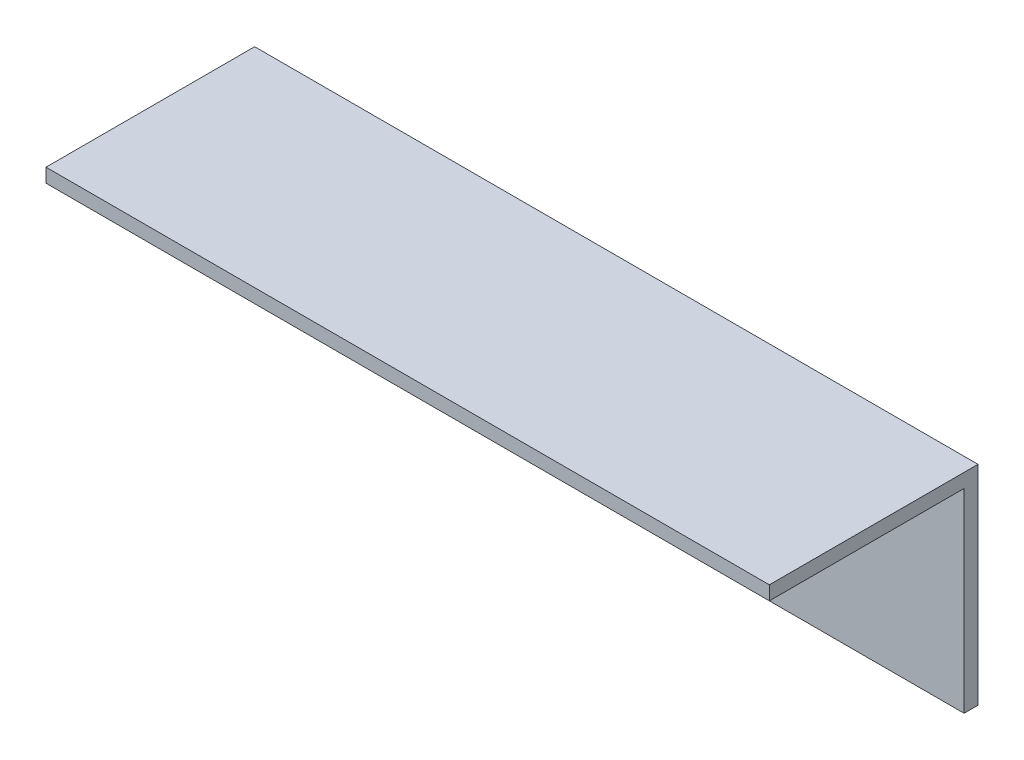
ISO-10303-21;
HEADER;
FILE_DESCRIPTION(('STEP AP214'),'2;1');
FILE_NAME('part.step','',(''),(''),'','','');
FILE_SCHEMA(('AUTOMOTIVE_DESIGN { 1 0 10303 214 1 1 1 1 }'));
ENDSEC;
DATA;
#1=APPLICATION_CONTEXT('core data for automotive mechanical design processes');
#2=APPLICATION_PROTOCOL_DEFINITION('international standard','automotive_design',2000,#1);
#3=PRODUCT_CONTEXT('',#1,'mechanical');
#4=PRODUCT('Part','Part','',(#3));
#5=PRODUCT_RELATED_PRODUCT_CATEGORY('part','',(#4));
#6=PRODUCT_DEFINITION_FORMATION('','',#4);
#7=PRODUCT_DEFINITION_CONTEXT('part definition',#1,'design');
#8=PRODUCT_DEFINITION('design','',#6,#7);
#9=PRODUCT_DEFINITION_SHAPE('','',#8);
#10=(LENGTH_UNIT() NAMED_UNIT(*) SI_UNIT(.MILLI.,.METRE.));
#11=(NAMED_UNIT(*) PLANE_ANGLE_UNIT() SI_UNIT($,.RADIAN.));
#12=(NAMED_UNIT(*) SI_UNIT($,.STERADIAN.) SOLID_ANGLE_UNIT());
#13=UNCERTAINTY_MEASURE_WITH_UNIT(LENGTH_MEASURE(1.E-05),#10,'distance_accuracy_value','');
#14=(GEOMETRIC_REPRESENTATION_CONTEXT(3) GLOBAL_UNCERTAINTY_ASSIGNED_CONTEXT((#13)) GLOBAL_UNIT_ASSIGNED_CONTEXT((#10,
#11,#12)) REPRESENTATION_CONTEXT('',''));
#15=CARTESIAN_POINT('',(0.,0.,0.));
#16=DIRECTION('',(0.,0.,1.));
#17=DIRECTION('',(1.,0.,0.));
#18=AXIS2_PLACEMENT_3D('',#15,#16,#17);
#19=CARTESIAN_POINT('',(0.,0.,30.));
#20=DIRECTION('',(0.,1.,0.));
#21=DIRECTION('',(0.,0.,1.));
#22=AXIS2_PLACEMENT_3D('',#19,#20,#21);
#23=PLANE('',#22);
#24=DIRECTION('',(1.,0.,0.));
#25=VECTOR('',#24,1.);
#26=CARTESIAN_POINT('',(-104.,0.,2.));
#27=LINE('',#26,#25);
#28=CARTESIAN_POINT('',(-104.,0.,2.));
#29=VERTEX_POINT('',#28);
#30=CARTESIAN_POINT('',(0.,0.,2.));
#31=VERTEX_POINT('',#30);
#32=EDGE_CURVE('E129',#29,#31,#27,.T.);
#33=ORIENTED_EDGE('',*,*,#32,.F.);
#34=DIRECTION('',(0.,0.,-1.));
#35=VECTOR('',#34,1.);
#36=CARTESIAN_POINT('',(-104.,0.,30.));
#37=LINE('',#36,#35);
#38=CARTESIAN_POINT('',(-104.,0.,0.));
#39=VERTEX_POINT('',#38);
#40=EDGE_CURVE('E88',#29,#39,#37,.T.);
#41=ORIENTED_EDGE('',*,*,#40,.T.);
#42=DIRECTION('',(1.,0.,0.));
#43=VECTOR('',#42,1.);
#44=CARTESIAN_POINT('',(0.,0.,0.));
#45=LINE('',#44,#43);
#46=CARTESIAN_POINT('',(0.,0.,0.));
#47=VERTEX_POINT('',#46);
#48=EDGE_CURVE('E92',#39,#47,#45,.T.);
#49=ORIENTED_EDGE('',*,*,#48,.T.);
#50=DIRECTION('',(0.,0.,-1.));
#51=VECTOR('',#50,1.);
#52=CARTESIAN_POINT('',(0.,0.,30.));
#53=LINE('',#52,#51);
#54=EDGE_CURVE('E77',#31,#47,#53,.T.);
#55=ORIENTED_EDGE('',*,*,#54,.F.);
#56=EDGE_LOOP('',(#33,#41,#49,#55));
#57=FACE_BOUND('',#56,.T.);
#58=ADVANCED_FACE('F33',(#57),#23,.F.);
#59=CARTESIAN_POINT('',(0.,0.,30.));
#60=DIRECTION('',(-1.,0.,0.));
#61=DIRECTION('',(0.,-1.,0.));
#62=AXIS2_PLACEMENT_3D('',#59,#60,#61);
#63=PLANE('',#62);
#64=DIRECTION('',(0.,1.,0.));
#65=VECTOR('',#64,1.);
#66=CARTESIAN_POINT('',(0.,0.,30.));
#67=LINE('',#66,#65);
#68=CARTESIAN_POINT('',(0.,28.,30.));
#69=VERTEX_POINT('',#68);
#70=CARTESIAN_POINT('',(0.,30.,30.));
#71=VERTEX_POINT('',#70);
#72=EDGE_CURVE('E97',#69,#71,#67,.T.);
#73=ORIENTED_EDGE('',*,*,#72,.F.);
#74=DIRECTION('',(0.,0.,1.));
#75=VECTOR('',#74,1.);
#76=CARTESIAN_POINT('',(0.,28.,2.));
#77=LINE('',#76,#75);
#78=CARTESIAN_POINT('',(0.,28.,2.));
#79=VERTEX_POINT('',#78);
#80=EDGE_CURVE('E48',#79,#69,#77,.T.);
#81=ORIENTED_EDGE('',*,*,#80,.F.);
#82=DIRECTION('',(0.,1.,0.));
#83=VECTOR('',#82,1.);
#84=CARTESIAN_POINT('',(0.,28.,2.));
#85=LINE('',#84,#83);
#86=EDGE_CURVE('E85',#31,#79,#85,.T.);
#87=ORIENTED_EDGE('',*,*,#86,.F.);
#88=ORIENTED_EDGE('',*,*,#54,.T.);
#89=DIRECTION('',(0.,1.,0.));
#90=VECTOR('',#89,1.);
#91=CARTESIAN_POINT('',(0.,0.,0.));
#92=LINE('',#91,#90);
#93=CARTESIAN_POINT('',(0.,30.,0.));
#94=VERTEX_POINT('',#93);
#95=EDGE_CURVE('E82',#47,#94,#92,.T.);
#96=ORIENTED_EDGE('',*,*,#95,.T.);
#97=DIRECTION('',(0.,0.,-1.));
#98=VECTOR('',#97,1.);
#99=CARTESIAN_POINT('',(0.,30.,30.));
#100=LINE('',#99,#98);
#101=EDGE_CURVE('E11',#71,#94,#100,.T.);
#102=ORIENTED_EDGE('',*,*,#101,.F.);
#103=EDGE_LOOP('',(#73,#81,#87,#88,#96,#102));
#104=FACE_BOUND('',#103,.T.);
#105=ADVANCED_FACE('F35',(#104),#63,.F.);
#106=CARTESIAN_POINT('',(0.,30.,30.));
#107=DIRECTION('',(0.,-1.,0.));
#108=DIRECTION('',(1.,0.,0.));
#109=AXIS2_PLACEMENT_3D('',#106,#107,#108);
#110=PLANE('',#109);
#111=DIRECTION('',(-1.,0.,0.));
#112=VECTOR('',#111,1.);
#113=CARTESIAN_POINT('',(0.,30.,0.));
#114=LINE('',#113,#112);
#115=CARTESIAN_POINT('',(-104.,30.,0.));
#116=VERTEX_POINT('',#115);
#117=EDGE_CURVE('E101',#94,#116,#114,.T.);
#118=ORIENTED_EDGE('',*,*,#117,.T.);
#119=DIRECTION('',(0.,0.,-1.));
#120=VECTOR('',#119,1.);
#121=CARTESIAN_POINT('',(-104.,30.,30.));
#122=LINE('',#121,#120);
#123=CARTESIAN_POINT('',(-104.,30.,30.));
#124=VERTEX_POINT('',#123);
#125=EDGE_CURVE('E41',#124,#116,#122,.T.);
#126=ORIENTED_EDGE('',*,*,#125,.F.);
#127=DIRECTION('',(-1.,0.,0.));
#128=VECTOR('',#127,1.);
#129=CARTESIAN_POINT('',(0.,30.,30.));
#130=LINE('',#129,#128);
#131=EDGE_CURVE('E57',#71,#124,#130,.T.);
#132=ORIENTED_EDGE('',*,*,#131,.F.);
#133=ORIENTED_EDGE('',*,*,#101,.T.);
#134=EDGE_LOOP('',(#118,#126,#132,#133));
#135=FACE_BOUND('',#134,.T.);
#136=ADVANCED_FACE('F117',(#135),#110,.F.);
#137=CARTESIAN_POINT('',(-104.,0.,30.));
#138=DIRECTION('',(1.,0.,0.));
#139=DIRECTION('',(0.,0.,-1.));
#140=AXIS2_PLACEMENT_3D('',#137,#138,#139);
#141=PLANE('',#140);
#142=DIRECTION('',(0.,-1.,0.));
#143=VECTOR('',#142,1.);
#144=CARTESIAN_POINT('',(-104.,28.,2.));
#145=LINE('',#144,#143);
#146=CARTESIAN_POINT('',(-104.,28.,2.));
#147=VERTEX_POINT('',#146);
#148=EDGE_CURVE('E125',#147,#29,#145,.T.);
#149=ORIENTED_EDGE('',*,*,#148,.F.);
#150=DIRECTION('',(0.,0.,1.));
#151=VECTOR('',#150,1.);
#152=CARTESIAN_POINT('',(-104.,28.,2.));
#153=LINE('',#152,#151);
#154=CARTESIAN_POINT('',(-104.,28.,30.));
#155=VERTEX_POINT('',#154);
#156=EDGE_CURVE('E102',#147,#155,#153,.T.);
#157=ORIENTED_EDGE('',*,*,#156,.T.);
#158=DIRECTION('',(0.,-1.,0.));
#159=VECTOR('',#158,1.);
#160=CARTESIAN_POINT('',(-104.,0.,30.));
#161=LINE('',#160,#159);
#162=EDGE_CURVE('E89',#124,#155,#161,.T.);
#163=ORIENTED_EDGE('',*,*,#162,.F.);
#164=ORIENTED_EDGE('',*,*,#125,.T.);
#165=DIRECTION('',(0.,-1.,0.));
#166=VECTOR('',#165,1.);
#167=CARTESIAN_POINT('',(-104.,0.,0.));
#168=LINE('',#167,#166);
#169=EDGE_CURVE('E98',#116,#39,#168,.T.);
#170=ORIENTED_EDGE('',*,*,#169,.T.);
#171=ORIENTED_EDGE('',*,*,#40,.F.);
#172=EDGE_LOOP('',(#149,#157,#163,#164,#170,#171));
#173=FACE_BOUND('',#172,.T.);
#174=ADVANCED_FACE('F115',(#173),#141,.F.);
#175=CARTESIAN_POINT('',(0.,0.,30.));
#176=DIRECTION('',(0.,0.,1.));
#177=DIRECTION('',(1.,0.,0.));
#178=AXIS2_PLACEMENT_3D('',#175,#176,#177);
#179=PLANE('',#178);
#180=DIRECTION('',(-1.,0.,0.));
#181=VECTOR('',#180,1.);
#182=CARTESIAN_POINT('',(-104.,28.,30.));
#183=LINE('',#182,#181);
#184=EDGE_CURVE('E123',#69,#155,#183,.T.);
#185=ORIENTED_EDGE('',*,*,#184,.F.);
#186=ORIENTED_EDGE('',*,*,#72,.T.);
#187=ORIENTED_EDGE('',*,*,#131,.T.);
#188=ORIENTED_EDGE('',*,*,#162,.T.);
#189=EDGE_LOOP('',(#185,#186,#187,#188));
#190=FACE_BOUND('',#189,.T.);
#191=ADVANCED_FACE('F143',(#190),#179,.T.);
#192=CARTESIAN_POINT('',(0.,0.,0.));
#193=DIRECTION('',(0.,0.,1.));
#194=DIRECTION('',(1.,0.,0.));
#195=AXIS2_PLACEMENT_3D('',#192,#193,#194);
#196=PLANE('',#195);
#197=ORIENTED_EDGE('',*,*,#95,.F.);
#198=ORIENTED_EDGE('',*,*,#48,.F.);
#199=ORIENTED_EDGE('',*,*,#169,.F.);
#200=ORIENTED_EDGE('',*,*,#117,.F.);
#201=EDGE_LOOP('',(#197,#198,#199,#200));
#202=FACE_BOUND('',#201,.T.);
#203=ADVANCED_FACE('F100',(#202),#196,.F.);
#204=CARTESIAN_POINT('',(-104.,28.,2.));
#205=DIRECTION('',(0.,1.,0.));
#206=DIRECTION('',(0.,0.,1.));
#207=AXIS2_PLACEMENT_3D('',#204,#205,#206);
#208=PLANE('',#207);
#209=ORIENTED_EDGE('',*,*,#184,.T.);
#210=ORIENTED_EDGE('',*,*,#156,.F.);
#211=DIRECTION('',(-1.,0.,0.));
#212=VECTOR('',#211,1.);
#213=CARTESIAN_POINT('',(-104.,28.,2.));
#214=LINE('',#213,#212);
#215=EDGE_CURVE('E121',#79,#147,#214,.T.);
#216=ORIENTED_EDGE('',*,*,#215,.F.);
#217=ORIENTED_EDGE('',*,*,#80,.T.);
#218=EDGE_LOOP('',(#209,#210,#216,#217));
#219=FACE_BOUND('',#218,.T.);
#220=ADVANCED_FACE('F142',(#219),#208,.F.);
#221=CARTESIAN_POINT('',(0.,0.,2.));
#222=DIRECTION('',(0.,0.,1.));
#223=DIRECTION('',(1.,0.,0.));
#224=AXIS2_PLACEMENT_3D('',#221,#222,#223);
#225=PLANE('',#224);
#226=ORIENTED_EDGE('',*,*,#148,.T.);
#227=ORIENTED_EDGE('',*,*,#32,.T.);
#228=ORIENTED_EDGE('',*,*,#86,.T.);
#229=ORIENTED_EDGE('',*,*,#215,.T.);
#230=EDGE_LOOP('',(#226,#227,#228,#229));
#231=FACE_BOUND('',#230,.T.);
#232=ADVANCED_FACE('F135',(#231),#225,.T.);
#233=CLOSED_SHELL('',(#58,#105,#136,#174,#191,#203,#220,#232));
#234=MANIFOLD_SOLID_BREP('B2',#233);
#235=ADVANCED_BREP_SHAPE_REPRESENTATION('',(#18,#234),#14);
#236=SHAPE_DEFINITION_REPRESENTATION(#9,#235);
ENDSEC;
END-ISO-10303-21;
